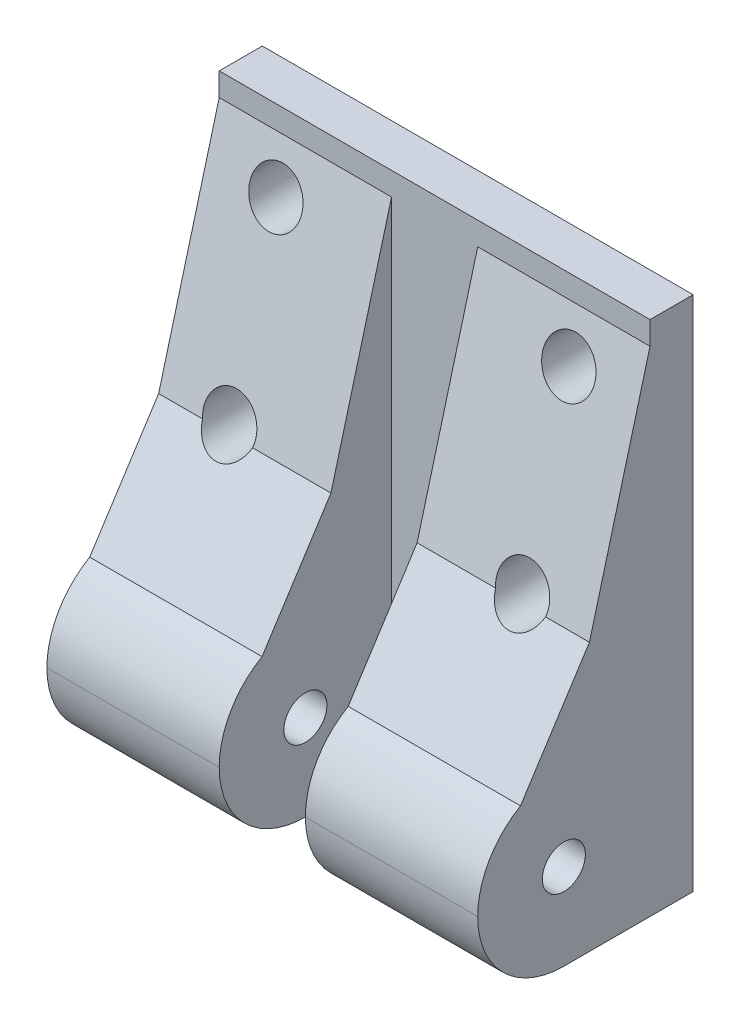
ISO-10303-21;
HEADER;
FILE_DESCRIPTION(('STEP AP214'),'2;1');
FILE_NAME('part.step','',(''),(''),'','','');
FILE_SCHEMA(('AUTOMOTIVE_DESIGN { 1 0 10303 214 1 1 1 1 }'));
ENDSEC;
DATA;
#1=APPLICATION_CONTEXT('core data for automotive mechanical design processes');
#2=APPLICATION_PROTOCOL_DEFINITION('international standard','automotive_design',2000,#1);
#3=PRODUCT_CONTEXT('',#1,'mechanical');
#4=PRODUCT('Part','Part','',(#3));
#5=PRODUCT_RELATED_PRODUCT_CATEGORY('part','',(#4));
#6=PRODUCT_DEFINITION_FORMATION('','',#4);
#7=PRODUCT_DEFINITION_CONTEXT('part definition',#1,'design');
#8=PRODUCT_DEFINITION('design','',#6,#7);
#9=PRODUCT_DEFINITION_SHAPE('','',#8);
#10=(LENGTH_UNIT() NAMED_UNIT(*) SI_UNIT(.MILLI.,.METRE.));
#11=(NAMED_UNIT(*) PLANE_ANGLE_UNIT() SI_UNIT($,.RADIAN.));
#12=(NAMED_UNIT(*) SI_UNIT($,.STERADIAN.) SOLID_ANGLE_UNIT());
#13=UNCERTAINTY_MEASURE_WITH_UNIT(LENGTH_MEASURE(1.E-05),#10,'distance_accuracy_value','');
#14=(GEOMETRIC_REPRESENTATION_CONTEXT(3) GLOBAL_UNCERTAINTY_ASSIGNED_CONTEXT((#13)) GLOBAL_UNIT_ASSIGNED_CONTEXT((#10,
#11,#12)) REPRESENTATION_CONTEXT('',''));
#15=CARTESIAN_POINT('',(0.,0.,0.));
#16=DIRECTION('',(0.,0.,1.));
#17=DIRECTION('',(1.,0.,0.));
#18=AXIS2_PLACEMENT_3D('',#15,#16,#17);
#19=CARTESIAN_POINT('',(0.,0.,5.));
#20=DIRECTION('',(0.,0.,-1.));
#21=DIRECTION('',(-1.,0.,0.));
#22=AXIS2_PLACEMENT_3D('',#19,#20,#21);
#23=PLANE('',#22);
#24=DIRECTION('',(0.,-1.,0.));
#25=VECTOR('',#24,1.);
#26=CARTESIAN_POINT('',(30.,20.,5.));
#27=LINE('',#26,#25);
#28=CARTESIAN_POINT('',(30.,57.3205080756897,5.));
#29=VERTEX_POINT('',#28);
#30=CARTESIAN_POINT('',(30.,0.,5.));
#31=VERTEX_POINT('',#30);
#32=EDGE_CURVE('E257',#29,#31,#27,.T.);
#33=ORIENTED_EDGE('',*,*,#32,.F.);
#34=DIRECTION('',(1.,0.,0.));
#35=VECTOR('',#34,1.);
#36=CARTESIAN_POINT('',(50.,57.3205080756897,5.));
#37=LINE('',#36,#35);
#38=CARTESIAN_POINT('',(50.,57.3205080756897,5.));
#39=VERTEX_POINT('',#38);
#40=EDGE_CURVE('E334',#29,#39,#37,.T.);
#41=ORIENTED_EDGE('',*,*,#40,.T.);
#42=DIRECTION('',(0.,-1.,0.));
#43=VECTOR('',#42,1.);
#44=CARTESIAN_POINT('',(50.,60.,5.));
#45=LINE('',#44,#43);
#46=CARTESIAN_POINT('',(50.,60.,5.));
#47=VERTEX_POINT('',#46);
#48=EDGE_CURVE('E231',#47,#39,#45,.T.);
#49=ORIENTED_EDGE('',*,*,#48,.F.);
#50=DIRECTION('',(1.,0.,0.));
#51=VECTOR('',#50,1.);
#52=CARTESIAN_POINT('',(0.,60.,5.));
#53=LINE('',#52,#51);
#54=CARTESIAN_POINT('',(0.,60.,5.));
#55=VERTEX_POINT('',#54);
#56=EDGE_CURVE('E220',#55,#47,#53,.T.);
#57=ORIENTED_EDGE('',*,*,#56,.F.);
#58=DIRECTION('',(0.,-1.,0.));
#59=VECTOR('',#58,1.);
#60=CARTESIAN_POINT('',(0.,60.,5.));
#61=LINE('',#60,#59);
#62=CARTESIAN_POINT('',(0.,57.3205080756897,5.));
#63=VERTEX_POINT('',#62);
#64=EDGE_CURVE('E235',#55,#63,#61,.T.);
#65=ORIENTED_EDGE('',*,*,#64,.T.);
#66=DIRECTION('',(1.,0.,0.));
#67=VECTOR('',#66,1.);
#68=CARTESIAN_POINT('',(20.,57.3205080756897,5.));
#69=LINE('',#68,#67);
#70=CARTESIAN_POINT('',(20.,57.3205080756897,5.));
#71=VERTEX_POINT('',#70);
#72=EDGE_CURVE('E324',#63,#71,#69,.T.);
#73=ORIENTED_EDGE('',*,*,#72,.T.);
#74=DIRECTION('',(0.,1.,0.));
#75=VECTOR('',#74,1.);
#76=CARTESIAN_POINT('',(20.,0.,5.));
#77=LINE('',#76,#75);
#78=CARTESIAN_POINT('',(20.,0.,5.));
#79=VERTEX_POINT('',#78);
#80=EDGE_CURVE('E261',#79,#71,#77,.T.);
#81=ORIENTED_EDGE('',*,*,#80,.F.);
#82=DIRECTION('',(1.,0.,0.));
#83=VECTOR('',#82,1.);
#84=CARTESIAN_POINT('',(0.,0.,5.));
#85=LINE('',#84,#83);
#86=EDGE_CURVE('E268',#79,#31,#85,.T.);
#87=ORIENTED_EDGE('',*,*,#86,.T.);
#88=EDGE_LOOP('',(#33,#41,#49,#57,#65,#73,#81,#87));
#89=FACE_BOUND('',#88,.T.);
#90=ADVANCED_FACE('F47',(#89),#23,.F.);
#91=CARTESIAN_POINT('',(0.,0.,5.));
#92=DIRECTION('',(1.,0.,0.));
#93=DIRECTION('',(0.,0.,-1.));
#94=AXIS2_PLACEMENT_3D('',#91,#92,#93);
#95=PLANE('',#94);
#96=CARTESIAN_POINT('',(0.,10.,15.));
#97=DIRECTION('',(-1.,0.,0.));
#98=DIRECTION('',(0.,0.,1.));
#99=AXIS2_PLACEMENT_3D('',#96,#97,#98);
#100=CIRCLE('',#99,2.5);
#101=CARTESIAN_POINT('',(0.,10.,17.5));
#102=VERTEX_POINT('',#101);
#103=EDGE_CURVE('E245',#102,#102,#100,.T.);
#104=ORIENTED_EDGE('',*,*,#103,.F.);
#105=EDGE_LOOP('',(#104));
#106=FACE_BOUND('',#105,.T.);
#107=DIRECTION('',(0.,0.,-1.));
#108=VECTOR('',#107,1.);
#109=CARTESIAN_POINT('',(0.,0.,5.));
#110=LINE('',#109,#108);
#111=CARTESIAN_POINT('',(0.,0.,15.));
#112=VERTEX_POINT('',#111);
#113=CARTESIAN_POINT('',(0.,0.,0.));
#114=VERTEX_POINT('',#113);
#115=EDGE_CURVE('E285',#112,#114,#110,.T.);
#116=ORIENTED_EDGE('',*,*,#115,.F.);
#117=CARTESIAN_POINT('',(0.,10.,15.));
#118=DIRECTION('',(1.,0.,0.));
#119=DIRECTION('',(0.,0.,-1.));
#120=AXIS2_PLACEMENT_3D('',#117,#118,#119);
#121=CIRCLE('',#120,10.);
#122=CARTESIAN_POINT('',(0.,10.,25.));
#123=VERTEX_POINT('',#122);
#124=EDGE_CURVE('E321',#112,#123,#121,.F.);
#125=ORIENTED_EDGE('',*,*,#124,.T.);
#126=CARTESIAN_POINT('',(0.,10.,15.));
#127=DIRECTION('',(1.,0.,0.));
#128=DIRECTION('',(0.,0.,-1.));
#129=AXIS2_PLACEMENT_3D('',#126,#127,#128);
#130=CIRCLE('',#129,10.);
#131=CARTESIAN_POINT('',(0.,18.6420141427541,20.0314601813429));
#132=VERTEX_POINT('',#131);
#133=EDGE_CURVE('E317',#123,#132,#130,.F.);
#134=ORIENTED_EDGE('',*,*,#133,.T.);
#135=DIRECTION('',(0.,-0.841058501010284,0.540944172607796));
#136=VECTOR('',#135,1.);
#137=CARTESIAN_POINT('',(0.,12.2938360515332,24.1144222357035));
#138=LINE('',#137,#136);
#139=CARTESIAN_POINT('',(0.,31.0815706560748,12.0307020918364));
#140=VERTEX_POINT('',#139);
#141=EDGE_CURVE('E166',#132,#140,#138,.F.);
#142=ORIENTED_EDGE('',*,*,#141,.T.);
#143=DIRECTION('',(0.,-0.96592582628907,0.258819045102515));
#144=VECTOR('',#143,1.);
#145=CARTESIAN_POINT('',(0.,3.83974596215549,19.3301270189221));
#146=LINE('',#145,#144);
#147=EDGE_CURVE('E348',#140,#63,#146,.F.);
#148=ORIENTED_EDGE('',*,*,#147,.T.);
#149=ORIENTED_EDGE('',*,*,#64,.F.);
#150=DIRECTION('',(0.,0.,1.));
#151=VECTOR('',#150,1.);
#152=CARTESIAN_POINT('',(0.,60.,0.));
#153=LINE('',#152,#151);
#154=CARTESIAN_POINT('',(0.,60.,0.));
#155=VERTEX_POINT('',#154);
#156=EDGE_CURVE('E210',#155,#55,#153,.T.);
#157=ORIENTED_EDGE('',*,*,#156,.F.);
#158=DIRECTION('',(0.,-1.,0.));
#159=VECTOR('',#158,1.);
#160=CARTESIAN_POINT('',(0.,0.,0.));
#161=LINE('',#160,#159);
#162=EDGE_CURVE('E267',#155,#114,#161,.T.);
#163=ORIENTED_EDGE('',*,*,#162,.T.);
#164=EDGE_LOOP('',(#116,#125,#134,#142,#148,#149,#157,#163));
#165=FACE_BOUND('',#164,.T.);
#166=ADVANCED_FACE('F387',(#106,#165),#95,.F.);
#167=CARTESIAN_POINT('',(0.,0.,5.));
#168=DIRECTION('',(0.,1.,0.));
#169=DIRECTION('',(0.,0.,1.));
#170=AXIS2_PLACEMENT_3D('',#167,#168,#169);
#171=PLANE('',#170);
#172=DIRECTION('',(0.,0.,-1.));
#173=VECTOR('',#172,1.);
#174=CARTESIAN_POINT('',(50.,0.,5.));
#175=LINE('',#174,#173);
#176=CARTESIAN_POINT('',(50.,0.,15.));
#177=VERTEX_POINT('',#176);
#178=CARTESIAN_POINT('',(50.,0.,0.));
#179=VERTEX_POINT('',#178);
#180=EDGE_CURVE('E272',#177,#179,#175,.T.);
#181=ORIENTED_EDGE('',*,*,#180,.F.);
#182=DIRECTION('',(1.,0.,0.));
#183=VECTOR('',#182,1.);
#184=CARTESIAN_POINT('',(0.,0.,15.));
#185=LINE('',#184,#183);
#186=CARTESIAN_POINT('',(30.,0.,15.));
#187=VERTEX_POINT('',#186);
#188=EDGE_CURVE('E308',#177,#187,#185,.F.);
#189=ORIENTED_EDGE('',*,*,#188,.T.);
#190=DIRECTION('',(0.,0.,-1.));
#191=VECTOR('',#190,1.);
#192=CARTESIAN_POINT('',(30.,0.,25.));
#193=LINE('',#192,#191);
#194=EDGE_CURVE('E254',#187,#31,#193,.T.);
#195=ORIENTED_EDGE('',*,*,#194,.T.);
#196=ORIENTED_EDGE('',*,*,#86,.F.);
#197=DIRECTION('',(0.,0.,-1.));
#198=VECTOR('',#197,1.);
#199=CARTESIAN_POINT('',(20.,0.,25.));
#200=LINE('',#199,#198);
#201=CARTESIAN_POINT('',(20.,0.,15.));
#202=VERTEX_POINT('',#201);
#203=EDGE_CURVE('E264',#202,#79,#200,.T.);
#204=ORIENTED_EDGE('',*,*,#203,.F.);
#205=DIRECTION('',(1.,0.,0.));
#206=VECTOR('',#205,1.);
#207=CARTESIAN_POINT('',(0.,0.,15.));
#208=LINE('',#207,#206);
#209=EDGE_CURVE('E304',#202,#112,#208,.F.);
#210=ORIENTED_EDGE('',*,*,#209,.T.);
#211=ORIENTED_EDGE('',*,*,#115,.T.);
#212=DIRECTION('',(1.,0.,0.));
#213=VECTOR('',#212,1.);
#214=CARTESIAN_POINT('',(0.,0.,0.));
#215=LINE('',#214,#213);
#216=EDGE_CURVE('E277',#114,#179,#215,.T.);
#217=ORIENTED_EDGE('',*,*,#216,.T.);
#218=EDGE_LOOP('',(#181,#189,#195,#196,#204,#210,#211,#217));
#219=FACE_BOUND('',#218,.T.);
#220=ADVANCED_FACE('F393',(#219),#171,.F.);
#221=CARTESIAN_POINT('',(50.,0.,5.));
#222=DIRECTION('',(-1.,0.,0.));
#223=DIRECTION('',(0.,0.,1.));
#224=AXIS2_PLACEMENT_3D('',#221,#222,#223);
#225=PLANE('',#224);
#226=CARTESIAN_POINT('',(50.,10.,15.));
#227=DIRECTION('',(-1.,0.,0.));
#228=DIRECTION('',(0.,0.,1.));
#229=AXIS2_PLACEMENT_3D('',#226,#227,#228);
#230=CIRCLE('',#229,2.5);
#231=CARTESIAN_POINT('',(50.,10.,17.5));
#232=VERTEX_POINT('',#231);
#233=EDGE_CURVE('E240',#232,#232,#230,.T.);
#234=ORIENTED_EDGE('',*,*,#233,.T.);
#235=EDGE_LOOP('',(#234));
#236=FACE_BOUND('',#235,.T.);
#237=ORIENTED_EDGE('',*,*,#48,.T.);
#238=DIRECTION('',(0.,0.96592582628907,-0.258819045102515));
#239=VECTOR('',#238,1.);
#240=CARTESIAN_POINT('',(50.,3.83974596215549,19.3301270189221));
#241=LINE('',#240,#239);
#242=CARTESIAN_POINT('',(50.,31.0815706560748,12.0307020918364));
#243=VERTEX_POINT('',#242);
#244=EDGE_CURVE('E338',#39,#243,#241,.F.);
#245=ORIENTED_EDGE('',*,*,#244,.T.);
#246=DIRECTION('',(0.,0.841058501010284,-0.540944172607796));
#247=VECTOR('',#246,1.);
#248=CARTESIAN_POINT('',(50.,12.2938360515332,24.1144222357035));
#249=LINE('',#248,#247);
#250=CARTESIAN_POINT('',(50.,18.6420141427541,20.0314601813429));
#251=VERTEX_POINT('',#250);
#252=EDGE_CURVE('E193',#243,#251,#249,.F.);
#253=ORIENTED_EDGE('',*,*,#252,.T.);
#254=CARTESIAN_POINT('',(50.,10.,15.));
#255=DIRECTION('',(-1.,0.,0.));
#256=DIRECTION('',(0.,0.,1.));
#257=AXIS2_PLACEMENT_3D('',#254,#255,#256);
#258=CIRCLE('',#257,10.);
#259=CARTESIAN_POINT('',(50.,10.,25.));
#260=VERTEX_POINT('',#259);
#261=EDGE_CURVE('E301',#251,#260,#258,.F.);
#262=ORIENTED_EDGE('',*,*,#261,.T.);
#263=CARTESIAN_POINT('',(50.,10.,15.));
#264=DIRECTION('',(-1.,0.,0.));
#265=DIRECTION('',(0.,0.,1.));
#266=AXIS2_PLACEMENT_3D('',#263,#264,#265);
#267=CIRCLE('',#266,10.);
#268=EDGE_CURVE('E298',#260,#177,#267,.F.);
#269=ORIENTED_EDGE('',*,*,#268,.T.);
#270=ORIENTED_EDGE('',*,*,#180,.T.);
#271=DIRECTION('',(0.,1.,0.));
#272=VECTOR('',#271,1.);
#273=CARTESIAN_POINT('',(50.,0.,0.));
#274=LINE('',#273,#272);
#275=CARTESIAN_POINT('',(50.,60.,0.));
#276=VERTEX_POINT('',#275);
#277=EDGE_CURVE('E273',#179,#276,#274,.T.);
#278=ORIENTED_EDGE('',*,*,#277,.T.);
#279=DIRECTION('',(0.,0.,-1.));
#280=VECTOR('',#279,1.);
#281=CARTESIAN_POINT('',(50.,60.,0.));
#282=LINE('',#281,#280);
#283=EDGE_CURVE('E223',#47,#276,#282,.T.);
#284=ORIENTED_EDGE('',*,*,#283,.F.);
#285=EDGE_LOOP('',(#237,#245,#253,#262,#269,#270,#278,#284));
#286=FACE_BOUND('',#285,.T.);
#287=ADVANCED_FACE('F364',(#236,#286),#225,.F.);
#288=CARTESIAN_POINT('',(0.,0.,0.));
#289=DIRECTION('',(0.,0.,-1.));
#290=DIRECTION('',(-1.,0.,0.));
#291=AXIS2_PLACEMENT_3D('',#288,#289,#290);
#292=PLANE('',#291);
#293=CARTESIAN_POINT('',(41.9999999999998,32.,0.));
#294=DIRECTION('',(0.,0.,-1.));
#295=DIRECTION('',(-1.,0.,0.));
#296=AXIS2_PLACEMENT_3D('',#293,#294,#295);
#297=CIRCLE('',#296,3.04334596854208);
#298=CARTESIAN_POINT('',(38.9566540314577,32.,0.));
#299=VERTEX_POINT('',#298);
#300=EDGE_CURVE('E654',#299,#299,#297,.T.);
#301=ORIENTED_EDGE('',*,*,#300,.F.);
#302=EDGE_LOOP('',(#301));
#303=FACE_BOUND('',#302,.T.);
#304=CARTESIAN_POINT('',(7.99999999999979,32.,0.));
#305=DIRECTION('',(0.,0.,-1.));
#306=DIRECTION('',(-1.,0.,0.));
#307=AXIS2_PLACEMENT_3D('',#304,#305,#306);
#308=CIRCLE('',#307,3.04334596854208);
#309=CARTESIAN_POINT('',(4.95665403145771,32.,0.));
#310=VERTEX_POINT('',#309);
#311=EDGE_CURVE('E651',#310,#310,#308,.T.);
#312=ORIENTED_EDGE('',*,*,#311,.F.);
#313=EDGE_LOOP('',(#312));
#314=FACE_BOUND('',#313,.T.);
#315=CARTESIAN_POINT('',(8.,52.,0.));
#316=DIRECTION('',(0.,0.,-1.));
#317=DIRECTION('',(-1.,0.,0.));
#318=AXIS2_PLACEMENT_3D('',#315,#316,#317);
#319=CIRCLE('',#318,3.04334596854208);
#320=CARTESIAN_POINT('',(4.95665403145792,52.,0.));
#321=VERTEX_POINT('',#320);
#322=EDGE_CURVE('E648',#321,#321,#319,.T.);
#323=ORIENTED_EDGE('',*,*,#322,.F.);
#324=EDGE_LOOP('',(#323));
#325=FACE_BOUND('',#324,.T.);
#326=CARTESIAN_POINT('',(42.,52.,0.));
#327=DIRECTION('',(0.,0.,-1.));
#328=DIRECTION('',(-1.,0.,0.));
#329=AXIS2_PLACEMENT_3D('',#326,#327,#328);
#330=CIRCLE('',#329,3.04334596854208);
#331=CARTESIAN_POINT('',(38.9566540314579,52.,0.));
#332=VERTEX_POINT('',#331);
#333=EDGE_CURVE('E176',#332,#332,#330,.T.);
#334=ORIENTED_EDGE('',*,*,#333,.F.);
#335=EDGE_LOOP('',(#334));
#336=FACE_BOUND('',#335,.T.);
#337=ORIENTED_EDGE('',*,*,#162,.F.);
#338=DIRECTION('',(-1.,0.,0.));
#339=VECTOR('',#338,1.);
#340=CARTESIAN_POINT('',(0.,60.,0.));
#341=LINE('',#340,#339);
#342=EDGE_CURVE('E227',#276,#155,#341,.T.);
#343=ORIENTED_EDGE('',*,*,#342,.F.);
#344=ORIENTED_EDGE('',*,*,#277,.F.);
#345=ORIENTED_EDGE('',*,*,#216,.F.);
#346=EDGE_LOOP('',(#337,#343,#344,#345));
#347=FACE_BOUND('',#346,.T.);
#348=ADVANCED_FACE('F400',(#303,#314,#325,#336,#347),#292,.T.);
#349=CARTESIAN_POINT('',(20.,0.,25.));
#350=DIRECTION('',(-1.,0.,0.));
#351=DIRECTION('',(0.,0.,1.));
#352=AXIS2_PLACEMENT_3D('',#349,#350,#351);
#353=PLANE('',#352);
#354=CARTESIAN_POINT('',(20.,10.,15.));
#355=DIRECTION('',(-1.,0.,0.));
#356=DIRECTION('',(0.,0.,1.));
#357=AXIS2_PLACEMENT_3D('',#354,#355,#356);
#358=CIRCLE('',#357,2.5);
#359=CARTESIAN_POINT('',(20.,10.,17.5));
#360=VERTEX_POINT('',#359);
#361=EDGE_CURVE('E250',#360,#360,#358,.T.);
#362=ORIENTED_EDGE('',*,*,#361,.T.);
#363=EDGE_LOOP('',(#362));
#364=FACE_BOUND('',#363,.T.);
#365=DIRECTION('',(0.,0.96592582628907,-0.258819045102515));
#366=VECTOR('',#365,1.);
#367=CARTESIAN_POINT('',(20.,-1.1602540378444,20.6698729810777));
#368=LINE('',#367,#366);
#369=CARTESIAN_POINT('',(20.,31.0815706560748,12.0307020918364));
#370=VERTEX_POINT('',#369);
#371=EDGE_CURVE('E345',#71,#370,#368,.F.);
#372=ORIENTED_EDGE('',*,*,#371,.T.);
#373=DIRECTION('',(0.,0.841058501010284,-0.540944172607796));
#374=VECTOR('',#373,1.);
#375=CARTESIAN_POINT('',(20.,3.19452215265795,29.9668341932702));
#376=LINE('',#375,#374);
#377=CARTESIAN_POINT('',(20.,18.6420141427541,20.0314601813429));
#378=VERTEX_POINT('',#377);
#379=EDGE_CURVE('E179',#370,#378,#376,.F.);
#380=ORIENTED_EDGE('',*,*,#379,.T.);
#381=CARTESIAN_POINT('',(20.,10.,15.));
#382=DIRECTION('',(-1.,0.,0.));
#383=DIRECTION('',(0.,0.,1.));
#384=AXIS2_PLACEMENT_3D('',#381,#382,#383);
#385=CIRCLE('',#384,10.);
#386=CARTESIAN_POINT('',(20.,10.,25.));
#387=VERTEX_POINT('',#386);
#388=EDGE_CURVE('E311',#378,#387,#385,.F.);
#389=ORIENTED_EDGE('',*,*,#388,.T.);
#390=CARTESIAN_POINT('',(20.,10.,15.));
#391=DIRECTION('',(-1.,0.,0.));
#392=DIRECTION('',(0.,0.,1.));
#393=AXIS2_PLACEMENT_3D('',#390,#391,#392);
#394=CIRCLE('',#393,10.);
#395=EDGE_CURVE('E314',#387,#202,#394,.F.);
#396=ORIENTED_EDGE('',*,*,#395,.T.);
#397=ORIENTED_EDGE('',*,*,#203,.T.);
#398=ORIENTED_EDGE('',*,*,#80,.T.);
#399=EDGE_LOOP('',(#372,#380,#389,#396,#397,#398));
#400=FACE_BOUND('',#399,.T.);
#401=ADVANCED_FACE('F398',(#364,#400),#353,.F.);
#402=CARTESIAN_POINT('',(30.,20.,25.));
#403=DIRECTION('',(1.,0.,0.));
#404=DIRECTION('',(0.,1.,0.));
#405=AXIS2_PLACEMENT_3D('',#402,#403,#404);
#406=PLANE('',#405);
#407=CARTESIAN_POINT('',(30.,10.,15.));
#408=DIRECTION('',(1.,0.,0.));
#409=DIRECTION('',(0.,1.,0.));
#410=AXIS2_PLACEMENT_3D('',#407,#408,#409);
#411=CIRCLE('',#410,2.5);
#412=CARTESIAN_POINT('',(30.,12.5,15.));
#413=VERTEX_POINT('',#412);
#414=EDGE_CURVE('E244',#413,#413,#411,.T.);
#415=ORIENTED_EDGE('',*,*,#414,.T.);
#416=EDGE_LOOP('',(#415));
#417=FACE_BOUND('',#416,.T.);
#418=CARTESIAN_POINT('',(30.,10.,15.));
#419=DIRECTION('',(1.,0.,0.));
#420=DIRECTION('',(0.,1.,0.));
#421=AXIS2_PLACEMENT_3D('',#418,#419,#420);
#422=CIRCLE('',#421,10.);
#423=CARTESIAN_POINT('',(30.,10.,25.));
#424=VERTEX_POINT('',#423);
#425=EDGE_CURVE('E288',#187,#424,#422,.F.);
#426=ORIENTED_EDGE('',*,*,#425,.T.);
#427=CARTESIAN_POINT('',(30.,10.,15.));
#428=DIRECTION('',(1.,0.,0.));
#429=DIRECTION('',(0.,1.,0.));
#430=AXIS2_PLACEMENT_3D('',#427,#428,#429);
#431=CIRCLE('',#430,10.);
#432=CARTESIAN_POINT('',(30.,18.6420141427541,20.0314601813429));
#433=VERTEX_POINT('',#432);
#434=EDGE_CURVE('E294',#424,#433,#431,.F.);
#435=ORIENTED_EDGE('',*,*,#434,.T.);
#436=DIRECTION('',(0.,-0.841058501010284,0.540944172607796));
#437=VECTOR('',#436,1.);
#438=CARTESIAN_POINT('',(30.,17.3421101950913,20.8675202943949));
#439=LINE('',#438,#437);
#440=CARTESIAN_POINT('',(30.,31.0815706560748,12.0307020918364));
#441=VERTEX_POINT('',#440);
#442=EDGE_CURVE('E196',#433,#441,#439,.F.);
#443=ORIENTED_EDGE('',*,*,#442,.T.);
#444=DIRECTION('',(0.,-0.96592582628907,0.258819045102515));
#445=VECTOR('',#444,1.);
#446=CARTESIAN_POINT('',(30.,17.5,15.6698729810778));
#447=LINE('',#446,#445);
#448=EDGE_CURVE('E342',#441,#29,#447,.F.);
#449=ORIENTED_EDGE('',*,*,#448,.T.);
#450=ORIENTED_EDGE('',*,*,#32,.T.);
#451=ORIENTED_EDGE('',*,*,#194,.F.);
#452=EDGE_LOOP('',(#426,#435,#443,#449,#450,#451));
#453=FACE_BOUND('',#452,.T.);
#454=ADVANCED_FACE('F482',(#417,#453),#406,.F.);
#455=CARTESIAN_POINT('',(50.,10.,15.));
#456=DIRECTION('',(-1.,0.,0.));
#457=DIRECTION('',(0.,0.,1.));
#458=AXIS2_PLACEMENT_3D('',#455,#456,#457);
#459=CYLINDRICAL_SURFACE('',#458,2.5);
#460=ORIENTED_EDGE('',*,*,#233,.F.);
#461=EDGE_LOOP('',(#460));
#462=FACE_BOUND('',#461,.T.);
#463=ORIENTED_EDGE('',*,*,#414,.F.);
#464=EDGE_LOOP('',(#463));
#465=FACE_BOUND('',#464,.T.);
#466=ADVANCED_FACE('F480',(#462,#465),#459,.F.);
#467=ORIENTED_EDGE('',*,*,#103,.T.);
#468=EDGE_LOOP('',(#467));
#469=FACE_BOUND('',#468,.T.);
#470=ORIENTED_EDGE('',*,*,#361,.F.);
#471=EDGE_LOOP('',(#470));
#472=FACE_BOUND('',#471,.T.);
#473=ADVANCED_FACE('F418',(#469,#472),#459,.F.);
#474=CARTESIAN_POINT('',(0.,10.,15.));
#475=DIRECTION('',(1.,0.,0.));
#476=DIRECTION('',(0.,0.,-1.));
#477=AXIS2_PLACEMENT_3D('',#474,#475,#476);
#478=CYLINDRICAL_SURFACE('',#477,10.);
#479=ORIENTED_EDGE('',*,*,#188,.F.);
#480=ORIENTED_EDGE('',*,*,#268,.F.);
#481=DIRECTION('',(1.,0.,0.));
#482=VECTOR('',#481,1.);
#483=CARTESIAN_POINT('',(0.,10.,25.));
#484=LINE('',#483,#482);
#485=EDGE_CURVE('E249',#424,#260,#484,.T.);
#486=ORIENTED_EDGE('',*,*,#485,.F.);
#487=ORIENTED_EDGE('',*,*,#425,.F.);
#488=EDGE_LOOP('',(#479,#480,#486,#487));
#489=FACE_BOUND('',#488,.T.);
#490=ADVANCED_FACE('F414',(#489),#478,.T.);
#491=CARTESIAN_POINT('',(0.,10.,15.));
#492=DIRECTION('',(-1.,0.,0.));
#493=DIRECTION('',(0.,0.,1.));
#494=AXIS2_PLACEMENT_3D('',#491,#492,#493);
#495=CYLINDRICAL_SURFACE('',#494,10.);
#496=ORIENTED_EDGE('',*,*,#261,.F.);
#497=DIRECTION('',(-1.,0.,0.));
#498=VECTOR('',#497,1.);
#499=CARTESIAN_POINT('',(0.,18.6420141427541,20.0314601813429));
#500=LINE('',#499,#498);
#501=EDGE_CURVE('E182',#251,#433,#500,.T.);
#502=ORIENTED_EDGE('',*,*,#501,.T.);
#503=ORIENTED_EDGE('',*,*,#434,.F.);
#504=ORIENTED_EDGE('',*,*,#485,.T.);
#505=EDGE_LOOP('',(#496,#502,#503,#504));
#506=FACE_BOUND('',#505,.T.);
#507=ADVANCED_FACE('F410',(#506),#495,.T.);
#508=CARTESIAN_POINT('',(0.,10.,15.));
#509=DIRECTION('',(-1.,0.,0.));
#510=DIRECTION('',(0.,0.,1.));
#511=AXIS2_PLACEMENT_3D('',#508,#509,#510);
#512=CYLINDRICAL_SURFACE('',#511,10.);
#513=ORIENTED_EDGE('',*,*,#388,.F.);
#514=DIRECTION('',(-1.,0.,0.));
#515=VECTOR('',#514,1.);
#516=CARTESIAN_POINT('',(0.,18.6420141427541,20.0314601813429));
#517=LINE('',#516,#515);
#518=EDGE_CURVE('E186',#378,#132,#517,.T.);
#519=ORIENTED_EDGE('',*,*,#518,.T.);
#520=ORIENTED_EDGE('',*,*,#133,.F.);
#521=DIRECTION('',(-1.,0.,0.));
#522=VECTOR('',#521,1.);
#523=CARTESIAN_POINT('',(0.,10.,25.));
#524=LINE('',#523,#522);
#525=EDGE_CURVE('E239',#387,#123,#524,.T.);
#526=ORIENTED_EDGE('',*,*,#525,.F.);
#527=EDGE_LOOP('',(#513,#519,#520,#526));
#528=FACE_BOUND('',#527,.T.);
#529=ADVANCED_FACE('F413',(#528),#512,.T.);
#530=CARTESIAN_POINT('',(0.,10.,15.));
#531=DIRECTION('',(1.,0.,0.));
#532=DIRECTION('',(0.,0.,-1.));
#533=AXIS2_PLACEMENT_3D('',#530,#531,#532);
#534=CYLINDRICAL_SURFACE('',#533,10.);
#535=ORIENTED_EDGE('',*,*,#124,.F.);
#536=ORIENTED_EDGE('',*,*,#209,.F.);
#537=ORIENTED_EDGE('',*,*,#395,.F.);
#538=ORIENTED_EDGE('',*,*,#525,.T.);
#539=EDGE_LOOP('',(#535,#536,#537,#538));
#540=FACE_BOUND('',#539,.T.);
#541=ADVANCED_FACE('F420',(#540),#534,.T.);
#542=CARTESIAN_POINT('',(0.,60.,0.));
#543=DIRECTION('',(0.,1.,0.));
#544=DIRECTION('',(0.,0.,1.));
#545=AXIS2_PLACEMENT_3D('',#542,#543,#544);
#546=PLANE('',#545);
#547=ORIENTED_EDGE('',*,*,#156,.T.);
#548=ORIENTED_EDGE('',*,*,#56,.T.);
#549=ORIENTED_EDGE('',*,*,#283,.T.);
#550=ORIENTED_EDGE('',*,*,#342,.T.);
#551=EDGE_LOOP('',(#547,#548,#549,#550));
#552=FACE_BOUND('',#551,.T.);
#553=ADVANCED_FACE('F423',(#552),#546,.T.);
#554=CARTESIAN_POINT('',(0.,57.3205080756897,5.));
#555=DIRECTION('',(0.,0.258819045102515,0.96592582628907));
#556=DIRECTION('',(-1.,0.,0.));
#557=AXIS2_PLACEMENT_3D('',#554,#555,#556);
#558=PLANE('',#557);
#559=CARTESIAN_POINT('',(42.,52.,6.42562584220429));
#560=DIRECTION('',(0.,0.258819045102515,0.96592582628907));
#561=DIRECTION('',(0.,0.96592582628907,-0.258819045102515));
#562=AXIS2_PLACEMENT_3D('',#559,#560,#561);
#563=ELLIPSE('',#562,3.15070358997867,3.04334596854208);
#564=CARTESIAN_POINT('',(42.,55.0433459685421,5.61016374764494));
#565=VERTEX_POINT('',#564);
#566=EDGE_CURVE('E52',#565,#565,#563,.F.);
#567=ORIENTED_EDGE('',*,*,#566,.T.);
#568=EDGE_LOOP('',(#567));
#569=FACE_BOUND('',#568,.T.);
#570=DIRECTION('',(-1.,0.,0.));
#571=VECTOR('',#570,1.);
#572=CARTESIAN_POINT('',(0.,31.0815706560748,12.0307020918364));
#573=LINE('',#572,#571);
#574=CARTESIAN_POINT('',(39.0985448091587,31.0815706560748,12.0307020918364));
#575=VERTEX_POINT('',#574);
#576=EDGE_CURVE('E187',#441,#575,#573,.F.);
#577=ORIENTED_EDGE('',*,*,#576,.T.);
#578=CARTESIAN_POINT('',(41.9999999999998,32.,11.7846096908266));
#579=DIRECTION('',(0.,0.258819045102515,0.96592582628907));
#580=DIRECTION('',(0.,0.96592582628907,-0.258819045102515));
#581=AXIS2_PLACEMENT_3D('',#578,#579,#580);
#582=ELLIPSE('',#581,3.15070358997867,3.04334596854208);
#583=CARTESIAN_POINT('',(44.9014551908409,31.0815706560748,12.0307020918364));
#584=VERTEX_POINT('',#583);
#585=EDGE_CURVE('E65',#575,#584,#582,.F.);
#586=ORIENTED_EDGE('',*,*,#585,.T.);
#587=EDGE_CURVE('E350',#584,#243,#573,.F.);
#588=ORIENTED_EDGE('',*,*,#587,.T.);
#589=ORIENTED_EDGE('',*,*,#244,.F.);
#590=ORIENTED_EDGE('',*,*,#40,.F.);
#591=ORIENTED_EDGE('',*,*,#448,.F.);
#592=EDGE_LOOP('',(#577,#586,#588,#589,#590,#591));
#593=FACE_BOUND('',#592,.T.);
#594=ADVANCED_FACE('F356',(#569,#593),#558,.T.);
#595=CARTESIAN_POINT('',(0.,57.3205080756897,5.));
#596=DIRECTION('',(0.,0.258819045102515,0.96592582628907));
#597=DIRECTION('',(-1.,0.,0.));
#598=AXIS2_PLACEMENT_3D('',#595,#596,#597);
#599=PLANE('',#598);
#600=CARTESIAN_POINT('',(8.,52.,6.42562584220429));
#601=DIRECTION('',(0.,0.258819045102515,0.96592582628907));
#602=DIRECTION('',(0.,0.96592582628907,-0.258819045102515));
#603=AXIS2_PLACEMENT_3D('',#600,#601,#602);
#604=ELLIPSE('',#603,3.15070358997867,3.04334596854208);
#605=CARTESIAN_POINT('',(8.,55.0433459685421,5.61016374764494));
#606=VERTEX_POINT('',#605);
#607=EDGE_CURVE('E202',#606,#606,#604,.F.);
#608=ORIENTED_EDGE('',*,*,#607,.T.);
#609=EDGE_LOOP('',(#608));
#610=FACE_BOUND('',#609,.T.);
#611=DIRECTION('',(-1.,0.,0.));
#612=VECTOR('',#611,1.);
#613=CARTESIAN_POINT('',(0.,31.0815706560748,12.0307020918364));
#614=LINE('',#613,#612);
#615=CARTESIAN_POINT('',(5.09854480915873,31.0815706560748,12.0307020918364));
#616=VERTEX_POINT('',#615);
#617=EDGE_CURVE('E174',#140,#616,#614,.F.);
#618=ORIENTED_EDGE('',*,*,#617,.T.);
#619=CARTESIAN_POINT('',(7.99999999999979,32.,11.7846096908266));
#620=DIRECTION('',(0.,0.258819045102515,0.96592582628907));
#621=DIRECTION('',(0.,0.96592582628907,-0.258819045102515));
#622=AXIS2_PLACEMENT_3D('',#619,#620,#621);
#623=ELLIPSE('',#622,3.15070358997867,3.04334596854208);
#624=CARTESIAN_POINT('',(10.9014551908409,31.0815706560748,12.0307020918364));
#625=VERTEX_POINT('',#624);
#626=EDGE_CURVE('E71',#616,#625,#623,.F.);
#627=ORIENTED_EDGE('',*,*,#626,.T.);
#628=EDGE_CURVE('E171',#625,#370,#614,.F.);
#629=ORIENTED_EDGE('',*,*,#628,.T.);
#630=ORIENTED_EDGE('',*,*,#371,.F.);
#631=ORIENTED_EDGE('',*,*,#72,.F.);
#632=ORIENTED_EDGE('',*,*,#147,.F.);
#633=EDGE_LOOP('',(#618,#627,#629,#630,#631,#632));
#634=FACE_BOUND('',#633,.T.);
#635=ADVANCED_FACE('F169',(#610,#634),#599,.T.);
#636=CARTESIAN_POINT('',(0.,31.0815706560748,12.0307020918364));
#637=DIRECTION('',(0.,0.540944172607796,0.841058501010284));
#638=DIRECTION('',(-1.,0.,0.));
#639=AXIS2_PLACEMENT_3D('',#636,#637,#638);
#640=PLANE('',#639);
#641=ORIENTED_EDGE('',*,*,#587,.F.);
#642=CARTESIAN_POINT('',(41.9999999999998,32.,11.4399952611563));
#643=DIRECTION('',(0.,0.540944172607796,0.841058501010284));
#644=DIRECTION('',(0.,0.841058501010284,-0.540944172607796));
#645=AXIS2_PLACEMENT_3D('',#642,#643,#644);
#646=ELLIPSE('',#645,3.61847120608899,3.04334596854208);
#647=EDGE_CURVE('E11',#584,#575,#646,.F.);
#648=ORIENTED_EDGE('',*,*,#647,.T.);
#649=ORIENTED_EDGE('',*,*,#576,.F.);
#650=ORIENTED_EDGE('',*,*,#442,.F.);
#651=ORIENTED_EDGE('',*,*,#501,.F.);
#652=ORIENTED_EDGE('',*,*,#252,.F.);
#653=EDGE_LOOP('',(#641,#648,#649,#650,#651,#652));
#654=FACE_BOUND('',#653,.T.);
#655=ADVANCED_FACE('F360',(#654),#640,.T.);
#656=CARTESIAN_POINT('',(0.,31.0815706560748,12.0307020918364));
#657=DIRECTION('',(0.,0.540944172607796,0.841058501010284));
#658=DIRECTION('',(-1.,0.,0.));
#659=AXIS2_PLACEMENT_3D('',#656,#657,#658);
#660=PLANE('',#659);
#661=ORIENTED_EDGE('',*,*,#628,.F.);
#662=CARTESIAN_POINT('',(7.99999999999979,32.,11.4399952611563));
#663=DIRECTION('',(0.,0.540944172607796,0.841058501010284));
#664=DIRECTION('',(0.,0.841058501010284,-0.540944172607796));
#665=AXIS2_PLACEMENT_3D('',#662,#663,#664);
#666=ELLIPSE('',#665,3.61847120608899,3.04334596854208);
#667=EDGE_CURVE('E58',#625,#616,#666,.F.);
#668=ORIENTED_EDGE('',*,*,#667,.T.);
#669=ORIENTED_EDGE('',*,*,#617,.F.);
#670=ORIENTED_EDGE('',*,*,#141,.F.);
#671=ORIENTED_EDGE('',*,*,#518,.F.);
#672=ORIENTED_EDGE('',*,*,#379,.F.);
#673=EDGE_LOOP('',(#661,#668,#669,#670,#671,#672));
#674=FACE_BOUND('',#673,.T.);
#675=ADVANCED_FACE('F50',(#674),#660,.T.);
#676=CARTESIAN_POINT('',(7.99999999999979,32.,25.));
#677=DIRECTION('',(0.,0.,-1.));
#678=DIRECTION('',(-1.,0.,0.));
#679=AXIS2_PLACEMENT_3D('',#676,#677,#678);
#680=CYLINDRICAL_SURFACE('',#679,3.04334596854208);
#681=ORIENTED_EDGE('',*,*,#311,.T.);
#682=EDGE_LOOP('',(#681));
#683=FACE_BOUND('',#682,.T.);
#684=ORIENTED_EDGE('',*,*,#667,.F.);
#685=ORIENTED_EDGE('',*,*,#626,.F.);
#686=EDGE_LOOP('',(#684,#685));
#687=FACE_BOUND('',#686,.T.);
#688=ADVANCED_FACE('F160',(#683,#687),#680,.F.);
#689=CARTESIAN_POINT('',(41.9999999999998,32.,25.));
#690=DIRECTION('',(0.,0.,-1.));
#691=DIRECTION('',(-1.,0.,0.));
#692=AXIS2_PLACEMENT_3D('',#689,#690,#691);
#693=CYLINDRICAL_SURFACE('',#692,3.04334596854208);
#694=ORIENTED_EDGE('',*,*,#300,.T.);
#695=EDGE_LOOP('',(#694));
#696=FACE_BOUND('',#695,.T.);
#697=ORIENTED_EDGE('',*,*,#647,.F.);
#698=ORIENTED_EDGE('',*,*,#585,.F.);
#699=EDGE_LOOP('',(#697,#698));
#700=FACE_BOUND('',#699,.T.);
#701=ADVANCED_FACE('F370',(#696,#700),#693,.F.);
#702=CARTESIAN_POINT('',(8.,52.,25.));
#703=DIRECTION('',(0.,0.,-1.));
#704=DIRECTION('',(-1.,0.,0.));
#705=AXIS2_PLACEMENT_3D('',#702,#703,#704);
#706=CYLINDRICAL_SURFACE('',#705,3.04334596854208);
#707=ORIENTED_EDGE('',*,*,#322,.T.);
#708=EDGE_LOOP('',(#707));
#709=FACE_BOUND('',#708,.T.);
#710=ORIENTED_EDGE('',*,*,#607,.F.);
#711=EDGE_LOOP('',(#710));
#712=FACE_BOUND('',#711,.T.);
#713=ADVANCED_FACE('F372',(#709,#712),#706,.F.);
#714=CARTESIAN_POINT('',(42.,52.,25.));
#715=DIRECTION('',(0.,0.,-1.));
#716=DIRECTION('',(-1.,0.,0.));
#717=AXIS2_PLACEMENT_3D('',#714,#715,#716);
#718=CYLINDRICAL_SURFACE('',#717,3.04334596854208);
#719=ORIENTED_EDGE('',*,*,#333,.T.);
#720=EDGE_LOOP('',(#719));
#721=FACE_BOUND('',#720,.T.);
#722=ORIENTED_EDGE('',*,*,#566,.F.);
#723=EDGE_LOOP('',(#722));
#724=FACE_BOUND('',#723,.T.);
#725=ADVANCED_FACE('F379',(#721,#724),#718,.F.);
#726=CLOSED_SHELL('',(#90,#166,#220,#287,#348,#401,#454,#466,#473,#490,#507,#529,#541,#553,#594,
#635,#655,#675,#688,#701,#713,#725));
#727=MANIFOLD_SOLID_BREP('B2',#726);
#728=ADVANCED_BREP_SHAPE_REPRESENTATION('',(#18,#727),#14);
#729=SHAPE_DEFINITION_REPRESENTATION(#9,#728);
ENDSEC;
END-ISO-10303-21;
